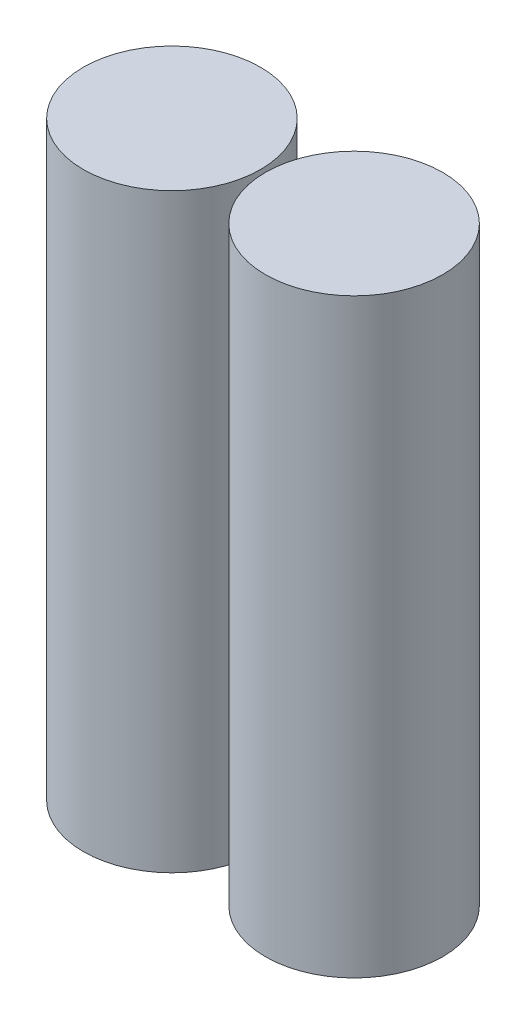
ISO-10303-21;
HEADER;
FILE_DESCRIPTION(('STEP AP214'),'2;1');
FILE_NAME('part.step','',(''),(''),'','','');
FILE_SCHEMA(('AUTOMOTIVE_DESIGN { 1 0 10303 214 1 1 1 1 }'));
ENDSEC;
DATA;
#1=APPLICATION_CONTEXT('core data for automotive mechanical design processes');
#2=APPLICATION_PROTOCOL_DEFINITION('international standard','automotive_design',2000,#1);
#3=PRODUCT_CONTEXT('',#1,'mechanical');
#4=PRODUCT('Part','Part','',(#3));
#5=PRODUCT_RELATED_PRODUCT_CATEGORY('part','',(#4));
#6=PRODUCT_DEFINITION_FORMATION('','',#4);
#7=PRODUCT_DEFINITION_CONTEXT('part definition',#1,'design');
#8=PRODUCT_DEFINITION('design','',#6,#7);
#9=PRODUCT_DEFINITION_SHAPE('','',#8);
#10=(LENGTH_UNIT() NAMED_UNIT(*) SI_UNIT(.MILLI.,.METRE.));
#11=(NAMED_UNIT(*) PLANE_ANGLE_UNIT() SI_UNIT($,.RADIAN.));
#12=(NAMED_UNIT(*) SI_UNIT($,.STERADIAN.) SOLID_ANGLE_UNIT());
#13=UNCERTAINTY_MEASURE_WITH_UNIT(LENGTH_MEASURE(1.E-05),#10,'distance_accuracy_value','');
#14=(GEOMETRIC_REPRESENTATION_CONTEXT(3) GLOBAL_UNCERTAINTY_ASSIGNED_CONTEXT((#13)) GLOBAL_UNIT_ASSIGNED_CONTEXT((#10,
#11,#12)) REPRESENTATION_CONTEXT('',''));
#15=CARTESIAN_POINT('',(0.,0.,0.));
#16=DIRECTION('',(0.,0.,1.));
#17=DIRECTION('',(1.,0.,0.));
#18=AXIS2_PLACEMENT_3D('',#15,#16,#17);
#19=CARTESIAN_POINT('',(18.5,60.,0.));
#20=DIRECTION('',(0.,-1.,0.));
#21=DIRECTION('',(0.,0.,-1.));
#22=AXIS2_PLACEMENT_3D('',#19,#20,#21);
#23=CYLINDRICAL_SURFACE('',#22,9.00000000000001);
#24=CARTESIAN_POINT('',(18.5,60.,0.));
#25=DIRECTION('',(0.,1.,0.));
#26=DIRECTION('',(0.,0.,1.));
#27=AXIS2_PLACEMENT_3D('',#24,#25,#26);
#28=CIRCLE('',#27,9.00000000000001);
#29=CARTESIAN_POINT('',(18.5,60.,9.00000000000001));
#30=VERTEX_POINT('',#29);
#31=EDGE_CURVE('E11',#30,#30,#28,.T.);
#32=ORIENTED_EDGE('',*,*,#31,.F.);
#33=EDGE_LOOP('',(#32));
#34=FACE_BOUND('',#33,.T.);
#35=CARTESIAN_POINT('',(18.5,0.,0.));
#36=DIRECTION('',(0.,1.,0.));
#37=DIRECTION('',(0.,0.,1.));
#38=AXIS2_PLACEMENT_3D('',#35,#36,#37);
#39=CIRCLE('',#38,9.00000000000001);
#40=CARTESIAN_POINT('',(18.5,0.,9.00000000000001));
#41=VERTEX_POINT('',#40);
#42=EDGE_CURVE('E44',#41,#41,#39,.T.);
#43=ORIENTED_EDGE('',*,*,#42,.T.);
#44=EDGE_LOOP('',(#43));
#45=FACE_BOUND('',#44,.T.);
#46=ADVANCED_FACE('F41',(#34,#45),#23,.T.);
#47=CARTESIAN_POINT('',(18.5,60.,0.));
#48=DIRECTION('',(0.,1.,0.));
#49=DIRECTION('',(0.,0.,1.));
#50=AXIS2_PLACEMENT_3D('',#47,#48,#49);
#51=PLANE('',#50);
#52=ORIENTED_EDGE('',*,*,#31,.T.);
#53=EDGE_LOOP('',(#52));
#54=FACE_BOUND('',#53,.T.);
#55=ADVANCED_FACE('F56',(#54),#51,.T.);
#56=CARTESIAN_POINT('',(18.5,0.,0.));
#57=DIRECTION('',(0.,1.,0.));
#58=DIRECTION('',(0.,0.,1.));
#59=AXIS2_PLACEMENT_3D('',#56,#57,#58);
#60=PLANE('',#59);
#61=ORIENTED_EDGE('',*,*,#42,.F.);
#62=EDGE_LOOP('',(#61));
#63=FACE_BOUND('',#62,.T.);
#64=ADVANCED_FACE('F54',(#63),#60,.F.);
#65=CLOSED_SHELL('',(#46,#55,#64));
#66=MANIFOLD_SOLID_BREP('B2',#65);
#67=CARTESIAN_POINT('',(0.,60.,0.));
#68=DIRECTION('',(0.,-1.,0.));
#69=DIRECTION('',(0.,0.,-1.));
#70=AXIS2_PLACEMENT_3D('',#67,#68,#69);
#71=CYLINDRICAL_SURFACE('',#70,9.);
#72=CARTESIAN_POINT('',(0.,60.,0.));
#73=DIRECTION('',(0.,1.,0.));
#74=DIRECTION('',(0.,0.,1.));
#75=AXIS2_PLACEMENT_3D('',#72,#73,#74);
#76=CIRCLE('',#75,9.);
#77=CARTESIAN_POINT('',(0.,60.,9.));
#78=VERTEX_POINT('',#77);
#79=EDGE_CURVE('E40',#78,#78,#76,.T.);
#80=ORIENTED_EDGE('',*,*,#79,.F.);
#81=EDGE_LOOP('',(#80));
#82=FACE_BOUND('',#81,.T.);
#83=CARTESIAN_POINT('',(0.,0.,0.));
#84=DIRECTION('',(0.,1.,0.));
#85=DIRECTION('',(0.,0.,1.));
#86=AXIS2_PLACEMENT_3D('',#83,#84,#85);
#87=CIRCLE('',#86,9.);
#88=CARTESIAN_POINT('',(0.,0.,9.));
#89=VERTEX_POINT('',#88);
#90=EDGE_CURVE('E85',#89,#89,#87,.T.);
#91=ORIENTED_EDGE('',*,*,#90,.T.);
#92=EDGE_LOOP('',(#91));
#93=FACE_BOUND('',#92,.T.);
#94=ADVANCED_FACE('F82',(#82,#93),#71,.T.);
#95=CARTESIAN_POINT('',(0.,60.,0.));
#96=DIRECTION('',(0.,1.,0.));
#97=DIRECTION('',(0.,0.,1.));
#98=AXIS2_PLACEMENT_3D('',#95,#96,#97);
#99=PLANE('',#98);
#100=ORIENTED_EDGE('',*,*,#79,.T.);
#101=EDGE_LOOP('',(#100));
#102=FACE_BOUND('',#101,.T.);
#103=ADVANCED_FACE('F97',(#102),#99,.T.);
#104=CARTESIAN_POINT('',(0.,0.,0.));
#105=DIRECTION('',(0.,1.,0.));
#106=DIRECTION('',(0.,0.,1.));
#107=AXIS2_PLACEMENT_3D('',#104,#105,#106);
#108=PLANE('',#107);
#109=ORIENTED_EDGE('',*,*,#90,.F.);
#110=EDGE_LOOP('',(#109));
#111=FACE_BOUND('',#110,.T.);
#112=ADVANCED_FACE('F95',(#111),#108,.F.);
#113=CLOSED_SHELL('',(#94,#103,#112));
#114=MANIFOLD_SOLID_BREP('B6',#113);
#115=ADVANCED_BREP_SHAPE_REPRESENTATION('',(#18,#66,#114),#14);
#116=SHAPE_DEFINITION_REPRESENTATION(#9,#115);
ENDSEC;
END-ISO-10303-21;
